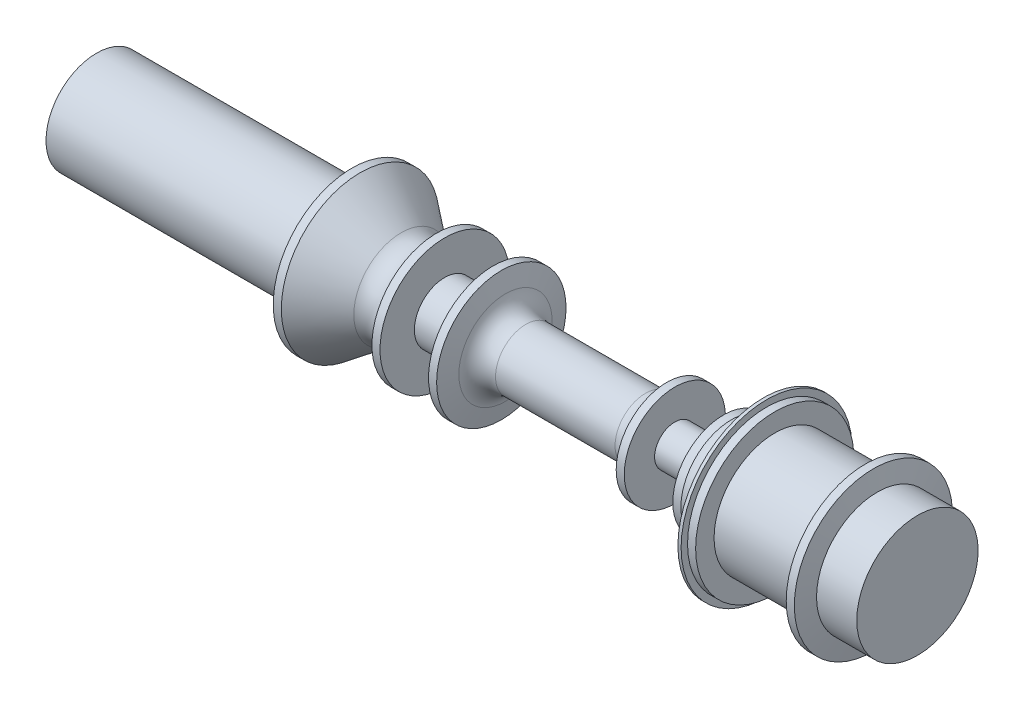
ISO-10303-21;
HEADER;
FILE_DESCRIPTION(('STEP AP214'),'2;1');
FILE_NAME('part.step','',(''),(''),'','','');
FILE_SCHEMA(('AUTOMOTIVE_DESIGN { 1 0 10303 214 1 1 1 1 }'));
ENDSEC;
DATA;
#1=APPLICATION_CONTEXT('core data for automotive mechanical design processes');
#2=APPLICATION_PROTOCOL_DEFINITION('international standard','automotive_design',2000,#1);
#3=PRODUCT_CONTEXT('',#1,'mechanical');
#4=PRODUCT('Part','Part','',(#3));
#5=PRODUCT_RELATED_PRODUCT_CATEGORY('part','',(#4));
#6=PRODUCT_DEFINITION_FORMATION('','',#4);
#7=PRODUCT_DEFINITION_CONTEXT('part definition',#1,'design');
#8=PRODUCT_DEFINITION('design','',#6,#7);
#9=PRODUCT_DEFINITION_SHAPE('','',#8);
#10=(LENGTH_UNIT() NAMED_UNIT(*) SI_UNIT(.MILLI.,.METRE.));
#11=(NAMED_UNIT(*) PLANE_ANGLE_UNIT() SI_UNIT($,.RADIAN.));
#12=(NAMED_UNIT(*) SI_UNIT($,.STERADIAN.) SOLID_ANGLE_UNIT());
#13=UNCERTAINTY_MEASURE_WITH_UNIT(LENGTH_MEASURE(1.E-05),#10,'distance_accuracy_value','');
#14=(GEOMETRIC_REPRESENTATION_CONTEXT(3) GLOBAL_UNCERTAINTY_ASSIGNED_CONTEXT((#13)) GLOBAL_UNIT_ASSIGNED_CONTEXT((#10,
#11,#12)) REPRESENTATION_CONTEXT('',''));
#15=CARTESIAN_POINT('',(0.,0.,0.));
#16=DIRECTION('',(0.,0.,1.));
#17=DIRECTION('',(1.,0.,0.));
#18=AXIS2_PLACEMENT_3D('',#15,#16,#17);
#19=CARTESIAN_POINT('',(296.06984855274,0.,0.));
#20=DIRECTION('',(1.,0.,0.));
#21=DIRECTION('',(0.,0.,-1.));
#22=AXIS2_PLACEMENT_3D('',#19,#20,#21);
#23=CYLINDRICAL_SURFACE('',#22,21.745125);
#24=CARTESIAN_POINT('',(50.8462213941202,0.,0.));
#25=DIRECTION('',(-1.,0.,0.));
#26=DIRECTION('',(0.,0.,1.));
#27=AXIS2_PLACEMENT_3D('',#24,#25,#26);
#28=CIRCLE('',#27,21.745125);
#29=CARTESIAN_POINT('',(50.8462213941202,0.,21.745125));
#30=VERTEX_POINT('',#29);
#31=EDGE_CURVE('E55',#30,#30,#28,.T.);
#32=ORIENTED_EDGE('',*,*,#31,.T.);
#33=EDGE_LOOP('',(#32));
#34=FACE_BOUND('',#33,.T.);
#35=CARTESIAN_POINT('',(-34.8404189496195,0.,0.));
#36=DIRECTION('',(1.,0.,0.));
#37=DIRECTION('',(0.,0.,-1.));
#38=AXIS2_PLACEMENT_3D('',#35,#36,#37);
#39=CIRCLE('',#38,21.745125);
#40=CARTESIAN_POINT('',(-34.8404189496195,0.,-21.745125));
#41=VERTEX_POINT('',#40);
#42=EDGE_CURVE('E58',#41,#41,#39,.T.);
#43=ORIENTED_EDGE('',*,*,#42,.T.);
#44=EDGE_LOOP('',(#43));
#45=FACE_BOUND('',#44,.T.);
#46=ADVANCED_FACE('F32',(#34,#45),#23,.T.);
#47=CARTESIAN_POINT('',(-46.7984241363148,0.,0.));
#48=DIRECTION('',(-1.,0.,0.));
#49=DIRECTION('',(0.,0.,1.));
#50=AXIS2_PLACEMENT_3D('',#47,#48,#49);
#51=CONICAL_SURFACE('',#50,21.745125,1.34606300619827);
#52=CARTESIAN_POINT('',(-49.4632225037763,0.,0.));
#53=DIRECTION('',(-1.,0.,0.));
#54=DIRECTION('',(0.,0.,1.));
#55=AXIS2_PLACEMENT_3D('',#52,#53,#54);
#56=CIRCLE('',#55,33.4024290496423);
#57=CARTESIAN_POINT('',(-49.4632225037763,0.,33.4024290496424));
#58=VERTEX_POINT('',#57);
#59=EDGE_CURVE('E47',#58,#58,#56,.T.);
#60=ORIENTED_EDGE('',*,*,#59,.T.);
#61=EDGE_LOOP('',(#60));
#62=FACE_BOUND('',#61,.T.);
#63=CARTESIAN_POINT('',(-52.4320214472609,0.,0.));
#64=DIRECTION('',(1.,0.,0.));
#65=DIRECTION('',(0.,0.,-1.));
#66=AXIS2_PLACEMENT_3D('',#63,#64,#65);
#67=CIRCLE('',#66,46.3896);
#68=CARTESIAN_POINT('',(-52.4320214472609,0.,-46.3896));
#69=VERTEX_POINT('',#68);
#70=EDGE_CURVE('E97',#69,#69,#67,.T.);
#71=ORIENTED_EDGE('',*,*,#70,.T.);
#72=EDGE_LOOP('',(#71));
#73=FACE_BOUND('',#72,.T.);
#74=ADVANCED_FACE('F166',(#62,#73),#51,.T.);
#75=CARTESIAN_POINT('',(296.06984855274,0.,0.));
#76=DIRECTION('',(1.,0.,0.));
#77=DIRECTION('',(0.,0.,-1.));
#78=AXIS2_PLACEMENT_3D('',#75,#76,#77);
#79=CYLINDRICAL_SURFACE('',#78,46.3896);
#80=CARTESIAN_POINT('',(-58.2307214472609,0.,0.));
#81=DIRECTION('',(1.,0.,0.));
#82=DIRECTION('',(0.,0.,-1.));
#83=AXIS2_PLACEMENT_3D('',#80,#81,#82);
#84=CIRCLE('',#83,46.3896);
#85=CARTESIAN_POINT('',(-58.2307214472609,0.,-46.3896));
#86=VERTEX_POINT('',#85);
#87=EDGE_CURVE('E94',#86,#86,#84,.T.);
#88=ORIENTED_EDGE('',*,*,#87,.T.);
#89=EDGE_LOOP('',(#88));
#90=FACE_BOUND('',#89,.T.);
#91=ORIENTED_EDGE('',*,*,#70,.F.);
#92=EDGE_LOOP('',(#91));
#93=FACE_BOUND('',#92,.T.);
#94=ADVANCED_FACE('F172',(#90,#93),#79,.T.);
#95=CARTESIAN_POINT('',(-58.2307214472609,0.,-46.3896));
#96=DIRECTION('',(-1.,0.,0.));
#97=DIRECTION('',(0.,0.,1.));
#98=AXIS2_PLACEMENT_3D('',#95,#96,#97);
#99=PLANE('',#98);
#100=CARTESIAN_POINT('',(-58.2307214472609,0.,0.));
#101=DIRECTION('',(1.,0.,0.));
#102=DIRECTION('',(0.,0.,-1.));
#103=AXIS2_PLACEMENT_3D('',#100,#101,#102);
#104=CIRCLE('',#103,21.745125);
#105=CARTESIAN_POINT('',(-58.2307214472609,0.,-21.745125));
#106=VERTEX_POINT('',#105);
#107=EDGE_CURVE('E91',#106,#106,#104,.T.);
#108=ORIENTED_EDGE('',*,*,#107,.T.);
#109=EDGE_LOOP('',(#108));
#110=FACE_BOUND('',#109,.T.);
#111=ORIENTED_EDGE('',*,*,#87,.F.);
#112=EDGE_LOOP('',(#111));
#113=FACE_BOUND('',#112,.T.);
#114=ADVANCED_FACE('F182',(#110,#113),#99,.T.);
#115=CARTESIAN_POINT('',(296.06984855274,0.,0.));
#116=DIRECTION('',(1.,0.,0.));
#117=DIRECTION('',(0.,0.,-1.));
#118=AXIS2_PLACEMENT_3D('',#115,#116,#117);
#119=CYLINDRICAL_SURFACE('',#118,21.745125);
#120=CARTESIAN_POINT('',(-93.0229214472609,0.,0.));
#121=DIRECTION('',(1.,0.,0.));
#122=DIRECTION('',(0.,0.,-1.));
#123=AXIS2_PLACEMENT_3D('',#120,#121,#122);
#124=CIRCLE('',#123,21.745125);
#125=CARTESIAN_POINT('',(-93.0229214472609,0.,-21.745125));
#126=VERTEX_POINT('',#125);
#127=EDGE_CURVE('E88',#126,#126,#124,.T.);
#128=ORIENTED_EDGE('',*,*,#127,.T.);
#129=EDGE_LOOP('',(#128));
#130=FACE_BOUND('',#129,.T.);
#131=ORIENTED_EDGE('',*,*,#107,.F.);
#132=EDGE_LOOP('',(#131));
#133=FACE_BOUND('',#132,.T.);
#134=ADVANCED_FACE('F186',(#130,#133),#119,.T.);
#135=CARTESIAN_POINT('',(-93.0229214472609,0.,-46.3896));
#136=DIRECTION('',(1.,0.,0.));
#137=DIRECTION('',(0.,0.,-1.));
#138=AXIS2_PLACEMENT_3D('',#135,#136,#137);
#139=PLANE('',#138);
#140=CARTESIAN_POINT('',(-93.0229214472609,0.,0.));
#141=DIRECTION('',(1.,0.,0.));
#142=DIRECTION('',(0.,0.,-1.));
#143=AXIS2_PLACEMENT_3D('',#140,#141,#142);
#144=CIRCLE('',#143,46.3896);
#145=CARTESIAN_POINT('',(-93.0229214472609,0.,-46.3896));
#146=VERTEX_POINT('',#145);
#147=EDGE_CURVE('E85',#146,#146,#144,.T.);
#148=ORIENTED_EDGE('',*,*,#147,.T.);
#149=EDGE_LOOP('',(#148));
#150=FACE_BOUND('',#149,.T.);
#151=ORIENTED_EDGE('',*,*,#127,.F.);
#152=EDGE_LOOP('',(#151));
#153=FACE_BOUND('',#152,.T.);
#154=ADVANCED_FACE('F190',(#150,#153),#139,.T.);
#155=CARTESIAN_POINT('',(296.06984855274,0.,0.));
#156=DIRECTION('',(1.,0.,0.));
#157=DIRECTION('',(0.,0.,-1.));
#158=AXIS2_PLACEMENT_3D('',#155,#156,#157);
#159=CYLINDRICAL_SURFACE('',#158,46.3896);
#160=CARTESIAN_POINT('',(-98.8216214472609,0.,0.));
#161=DIRECTION('',(1.,0.,0.));
#162=DIRECTION('',(0.,0.,-1.));
#163=AXIS2_PLACEMENT_3D('',#160,#161,#162);
#164=CIRCLE('',#163,46.3896);
#165=CARTESIAN_POINT('',(-98.8216214472609,0.,-46.3896));
#166=VERTEX_POINT('',#165);
#167=EDGE_CURVE('E82',#166,#166,#164,.T.);
#168=ORIENTED_EDGE('',*,*,#167,.T.);
#169=EDGE_LOOP('',(#168));
#170=FACE_BOUND('',#169,.T.);
#171=ORIENTED_EDGE('',*,*,#147,.F.);
#172=EDGE_LOOP('',(#171));
#173=FACE_BOUND('',#172,.T.);
#174=ADVANCED_FACE('F194',(#170,#173),#159,.T.);
#175=CARTESIAN_POINT('',(-98.8216214472609,0.,0.));
#176=DIRECTION('',(1.,0.,0.));
#177=DIRECTION('',(0.,0.,-1.));
#178=AXIS2_PLACEMENT_3D('',#175,#176,#177);
#179=CONICAL_SURFACE('',#178,46.3896,1.20730668683403);
#180=CARTESIAN_POINT('',(-101.038175072092,0.,0.));
#181=DIRECTION('',(1.,0.,0.));
#182=DIRECTION('',(0.,0.,-1.));
#183=AXIS2_PLACEMENT_3D('',#180,#181,#182);
#184=CIRCLE('',#183,40.5625775842079);
#185=CARTESIAN_POINT('',(-101.038175072092,0.,-40.5625775842078));
#186=VERTEX_POINT('',#185);
#187=EDGE_CURVE('E64',#186,#186,#184,.T.);
#188=ORIENTED_EDGE('',*,*,#187,.T.);
#189=EDGE_LOOP('',(#188));
#190=FACE_BOUND('',#189,.T.);
#191=ORIENTED_EDGE('',*,*,#167,.F.);
#192=EDGE_LOOP('',(#191));
#193=FACE_BOUND('',#192,.T.);
#194=ADVANCED_FACE('F198',(#190,#193),#179,.T.);
#195=CARTESIAN_POINT('',(-108.196186447261,0.,0.));
#196=DIRECTION('',(-1.,0.,0.));
#197=DIRECTION('',(0.,0.,1.));
#198=AXIS2_PLACEMENT_3D('',#195,#196,#197);
#199=CONICAL_SURFACE('',#198,21.745125,0.65363589691952);
#200=CARTESIAN_POINT('',(-124.179255500738,0.,0.));
#201=DIRECTION('',(-1.,0.,0.));
#202=DIRECTION('',(0.,0.,1.));
#203=AXIS2_PLACEMENT_3D('',#200,#201,#202);
#204=CIRCLE('',#203,33.9874757643652);
#205=CARTESIAN_POINT('',(-124.179255500738,0.,33.9874757643653));
#206=VERTEX_POINT('',#205);
#207=EDGE_CURVE('E61',#206,#206,#204,.T.);
#208=ORIENTED_EDGE('',*,*,#207,.T.);
#209=EDGE_LOOP('',(#208));
#210=FACE_BOUND('',#209,.T.);
#211=CARTESIAN_POINT('',(-153.619336447261,0.,0.));
#212=DIRECTION('',(1.,0.,0.));
#213=DIRECTION('',(0.,0.,-1.));
#214=AXIS2_PLACEMENT_3D('',#211,#212,#213);
#215=CIRCLE('',#214,56.537325);
#216=CARTESIAN_POINT('',(-153.619336447261,0.,-56.537325));
#217=VERTEX_POINT('',#216);
#218=EDGE_CURVE('E79',#217,#217,#215,.T.);
#219=ORIENTED_EDGE('',*,*,#218,.T.);
#220=EDGE_LOOP('',(#219));
#221=FACE_BOUND('',#220,.T.);
#222=ADVANCED_FACE('F202',(#210,#221),#199,.T.);
#223=CARTESIAN_POINT('',(296.06984855274,0.,0.));
#224=DIRECTION('',(1.,0.,0.));
#225=DIRECTION('',(0.,0.,-1.));
#226=AXIS2_PLACEMENT_3D('',#223,#224,#225);
#227=CYLINDRICAL_SURFACE('',#226,56.537325);
#228=CARTESIAN_POINT('',(-159.418036447261,0.,0.));
#229=DIRECTION('',(1.,0.,0.));
#230=DIRECTION('',(0.,0.,-1.));
#231=AXIS2_PLACEMENT_3D('',#228,#229,#230);
#232=CIRCLE('',#231,56.537325);
#233=CARTESIAN_POINT('',(-159.418036447261,0.,-56.537325));
#234=VERTEX_POINT('',#233);
#235=EDGE_CURVE('E76',#234,#234,#232,.T.);
#236=ORIENTED_EDGE('',*,*,#235,.T.);
#237=EDGE_LOOP('',(#236));
#238=FACE_BOUND('',#237,.T.);
#239=ORIENTED_EDGE('',*,*,#218,.F.);
#240=EDGE_LOOP('',(#239));
#241=FACE_BOUND('',#240,.T.);
#242=ADVANCED_FACE('F161',(#238,#241),#227,.T.);
#243=CARTESIAN_POINT('',(-159.418036447261,0.,-36.241875));
#244=DIRECTION('',(-1.,0.,0.));
#245=DIRECTION('',(0.,0.,1.));
#246=AXIS2_PLACEMENT_3D('',#243,#244,#245);
#247=PLANE('',#246);
#248=CARTESIAN_POINT('',(-159.418036447261,0.,0.));
#249=DIRECTION('',(1.,0.,0.));
#250=DIRECTION('',(0.,0.,-1.));
#251=AXIS2_PLACEMENT_3D('',#248,#249,#250);
#252=CIRCLE('',#251,36.241875);
#253=CARTESIAN_POINT('',(-159.418036447261,0.,-36.241875));
#254=VERTEX_POINT('',#253);
#255=EDGE_CURVE('E73',#254,#254,#252,.T.);
#256=ORIENTED_EDGE('',*,*,#255,.T.);
#257=EDGE_LOOP('',(#256));
#258=FACE_BOUND('',#257,.T.);
#259=ORIENTED_EDGE('',*,*,#235,.F.);
#260=EDGE_LOOP('',(#259));
#261=FACE_BOUND('',#260,.T.);
#262=ADVANCED_FACE('F151',(#258,#261),#247,.T.);
#263=CARTESIAN_POINT('',(296.06984855274,0.,0.));
#264=DIRECTION('',(1.,0.,0.));
#265=DIRECTION('',(0.,0.,-1.));
#266=AXIS2_PLACEMENT_3D('',#263,#264,#265);
#267=CYLINDRICAL_SURFACE('',#266,36.241875);
#268=ORIENTED_EDGE('',*,*,#255,.F.);
#269=EDGE_LOOP('',(#268));
#270=FACE_BOUND('',#269,.T.);
#271=CARTESIAN_POINT('',(-342.602101447261,0.,0.));
#272=DIRECTION('',(-1.,0.,0.));
#273=DIRECTION('',(0.,0.,1.));
#274=AXIS2_PLACEMENT_3D('',#271,#272,#273);
#275=CIRCLE('',#274,36.2418750000001);
#276=CARTESIAN_POINT('',(-342.602101447261,0.,36.2418750000001));
#277=VERTEX_POINT('',#276);
#278=EDGE_CURVE('E142',#277,#277,#275,.T.);
#279=ORIENTED_EDGE('',*,*,#278,.F.);
#280=EDGE_LOOP('',(#279));
#281=FACE_BOUND('',#280,.T.);
#282=ADVANCED_FACE('F148',(#270,#281),#267,.T.);
#283=CARTESIAN_POINT('',(71.9500935527391,0.,0.));
#284=DIRECTION('',(-1.,0.,0.));
#285=DIRECTION('',(0.,0.,1.));
#286=AXIS2_PLACEMENT_3D('',#283,#284,#285);
#287=PLANE('',#286);
#288=CARTESIAN_POINT('',(71.9500935527391,0.,0.));
#289=DIRECTION('',(-1.,0.,0.));
#290=DIRECTION('',(0.,0.,1.));
#291=AXIS2_PLACEMENT_3D('',#288,#289,#290);
#292=CIRCLE('',#291,14.49675);
#293=CARTESIAN_POINT('',(71.9500935527391,0.,14.49675));
#294=VERTEX_POINT('',#293);
#295=EDGE_CURVE('E103',#294,#294,#292,.T.);
#296=ORIENTED_EDGE('',*,*,#295,.T.);
#297=EDGE_LOOP('',(#296));
#298=FACE_BOUND('',#297,.T.);
#299=CARTESIAN_POINT('',(71.9500935527391,0.,0.));
#300=DIRECTION('',(-1.,0.,0.));
#301=DIRECTION('',(0.,0.,1.));
#302=AXIS2_PLACEMENT_3D('',#299,#300,#301);
#303=CIRCLE('',#302,36.2418750000001);
#304=CARTESIAN_POINT('',(71.9500935527391,0.,36.241875));
#305=VERTEX_POINT('',#304);
#306=EDGE_CURVE('E70',#305,#305,#303,.T.);
#307=ORIENTED_EDGE('',*,*,#306,.F.);
#308=EDGE_LOOP('',(#307));
#309=FACE_BOUND('',#308,.T.);
#310=ADVANCED_FACE('F150',(#298,#309),#287,.F.);
#311=CARTESIAN_POINT('',(57.4533435527391,0.,0.));
#312=DIRECTION('',(-1.,0.,0.));
#313=DIRECTION('',(0.,0.,1.));
#314=AXIS2_PLACEMENT_3D('',#311,#312,#313);
#315=CYLINDRICAL_SURFACE('',#314,36.241875);
#316=CARTESIAN_POINT('',(66.1513935527391,0.,0.));
#317=DIRECTION('',(-1.,0.,0.));
#318=DIRECTION('',(0.,0.,1.));
#319=AXIS2_PLACEMENT_3D('',#316,#317,#318);
#320=CIRCLE('',#319,36.241875);
#321=CARTESIAN_POINT('',(66.1513935527391,0.,36.241875));
#322=VERTEX_POINT('',#321);
#323=EDGE_CURVE('E67',#322,#322,#320,.T.);
#324=ORIENTED_EDGE('',*,*,#323,.F.);
#325=EDGE_LOOP('',(#324));
#326=FACE_BOUND('',#325,.T.);
#327=ORIENTED_EDGE('',*,*,#306,.T.);
#328=EDGE_LOOP('',(#327));
#329=FACE_BOUND('',#328,.T.);
#330=ADVANCED_FACE('F158',(#326,#329),#315,.T.);
#331=CARTESIAN_POINT('',(66.1513935527391,0.,0.));
#332=DIRECTION('',(1.,0.,0.));
#333=DIRECTION('',(0.,0.,-1.));
#334=AXIS2_PLACEMENT_3D('',#331,#332,#333);
#335=CONICAL_SURFACE('',#334,36.241875,1.33525134607403);
#336=CARTESIAN_POINT('',(65.4320309238279,0.,0.));
#337=DIRECTION('',(-1.,0.,0.));
#338=DIRECTION('',(0.,0.,1.));
#339=AXIS2_PLACEMENT_3D('',#336,#337,#338);
#340=CIRCLE('',#339,33.2445307128702);
#341=CARTESIAN_POINT('',(65.4320309238279,0.,33.2445307128701));
#342=VERTEX_POINT('',#341);
#343=EDGE_CURVE('E52',#342,#342,#340,.F.);
#344=ORIENTED_EDGE('',*,*,#343,.T.);
#345=EDGE_LOOP('',(#344));
#346=FACE_BOUND('',#345,.T.);
#347=ORIENTED_EDGE('',*,*,#323,.T.);
#348=EDGE_LOOP('',(#347));
#349=FACE_BOUND('',#348,.T.);
#350=ADVANCED_FACE('F241',(#346,#349),#335,.T.);
#351=CARTESIAN_POINT('',(106.742293552739,36.241875,0.));
#352=DIRECTION('',(1.,0.,0.));
#353=DIRECTION('',(0.,0.,-1.));
#354=AXIS2_PLACEMENT_3D('',#351,#352,#353);
#355=PLANE('',#354);
#356=CARTESIAN_POINT('',(106.742293552739,0.,0.));
#357=DIRECTION('',(-1.,0.,0.));
#358=DIRECTION('',(0.,0.,1.));
#359=AXIS2_PLACEMENT_3D('',#356,#357,#358);
#360=CIRCLE('',#359,14.49675);
#361=CARTESIAN_POINT('',(106.742293552739,0.,14.49675));
#362=VERTEX_POINT('',#361);
#363=EDGE_CURVE('E100',#362,#362,#360,.T.);
#364=ORIENTED_EDGE('',*,*,#363,.F.);
#365=EDGE_LOOP('',(#364));
#366=FACE_BOUND('',#365,.T.);
#367=CARTESIAN_POINT('',(106.742293552739,0.,0.));
#368=DIRECTION('',(-1.,0.,0.));
#369=DIRECTION('',(0.,0.,1.));
#370=AXIS2_PLACEMENT_3D('',#367,#368,#369);
#371=CIRCLE('',#370,36.241875);
#372=CARTESIAN_POINT('',(106.742293552739,0.,36.241875));
#373=VERTEX_POINT('',#372);
#374=EDGE_CURVE('E133',#373,#373,#371,.T.);
#375=ORIENTED_EDGE('',*,*,#374,.T.);
#376=EDGE_LOOP('',(#375));
#377=FACE_BOUND('',#376,.T.);
#378=ADVANCED_FACE('F177',(#366,#377),#355,.F.);
#379=CARTESIAN_POINT('',(71.9500935527391,0.,0.));
#380=DIRECTION('',(-1.,0.,0.));
#381=DIRECTION('',(0.,0.,1.));
#382=AXIS2_PLACEMENT_3D('',#379,#380,#381);
#383=CYLINDRICAL_SURFACE('',#382,14.49675);
#384=ORIENTED_EDGE('',*,*,#295,.F.);
#385=EDGE_LOOP('',(#384));
#386=FACE_BOUND('',#385,.T.);
#387=ORIENTED_EDGE('',*,*,#363,.T.);
#388=EDGE_LOOP('',(#387));
#389=FACE_BOUND('',#388,.T.);
#390=ADVANCED_FACE('F259',(#386,#389),#383,.T.);
#391=CARTESIAN_POINT('',(71.9500935527391,0.,0.));
#392=DIRECTION('',(-1.,0.,0.));
#393=DIRECTION('',(0.,0.,1.));
#394=AXIS2_PLACEMENT_3D('',#391,#392,#393);
#395=CYLINDRICAL_SURFACE('',#394,36.241875);
#396=ORIENTED_EDGE('',*,*,#374,.F.);
#397=EDGE_LOOP('',(#396));
#398=FACE_BOUND('',#397,.T.);
#399=CARTESIAN_POINT('',(112.540993552739,0.,0.));
#400=DIRECTION('',(-1.,0.,0.));
#401=DIRECTION('',(0.,0.,1.));
#402=AXIS2_PLACEMENT_3D('',#399,#400,#401);
#403=CIRCLE('',#402,36.241875);
#404=CARTESIAN_POINT('',(112.540993552739,0.,36.241875));
#405=VERTEX_POINT('',#404);
#406=EDGE_CURVE('E130',#405,#405,#403,.T.);
#407=ORIENTED_EDGE('',*,*,#406,.T.);
#408=EDGE_LOOP('',(#407));
#409=FACE_BOUND('',#408,.T.);
#410=ADVANCED_FACE('F268',(#398,#409),#395,.T.);
#411=CARTESIAN_POINT('',(-115.05810233391,0.,0.));
#412=DIRECTION('',(1.,0.,0.));
#413=DIRECTION('',(0.,0.,-1.));
#414=AXIS2_PLACEMENT_3D('',#411,#412,#413);
#415=TOROIDAL_SURFACE('',#414,45.8956479543898,15.);
#416=ORIENTED_EDGE('',*,*,#207,.F.);
#417=EDGE_LOOP('',(#416));
#418=FACE_BOUND('',#417,.T.);
#419=ORIENTED_EDGE('',*,*,#187,.F.);
#420=EDGE_LOOP('',(#419));
#421=FACE_BOUND('',#420,.T.);
#422=ADVANCED_FACE('F278',(#418,#421),#415,.F.);
#423=CARTESIAN_POINT('',(117.883327615519,0.,0.));
#424=DIRECTION('',(-1.,0.,0.));
#425=DIRECTION('',(0.,0.,1.));
#426=AXIS2_PLACEMENT_3D('',#423,#424,#425);
#427=TOROIDAL_SURFACE('',#426,50.2582749215798,15.);
#428=CARTESIAN_POINT('',(131.094808933832,0.,0.));
#429=DIRECTION('',(-1.,0.,0.));
#430=DIRECTION('',(0.,0.,1.));
#431=AXIS2_PLACEMENT_3D('',#428,#429,#430);
#432=CIRCLE('',#431,43.1549826302647);
#433=CARTESIAN_POINT('',(131.094808933832,0.,43.1549826302647));
#434=VERTEX_POINT('',#433);
#435=EDGE_CURVE('E10',#434,#434,#432,.T.);
#436=ORIENTED_EDGE('',*,*,#435,.T.);
#437=EDGE_LOOP('',(#436));
#438=FACE_BOUND('',#437,.T.);
#439=ORIENTED_EDGE('',*,*,#406,.F.);
#440=EDGE_LOOP('',(#439));
#441=FACE_BOUND('',#440,.T.);
#442=ADVANCED_FACE('F290',(#438,#441),#427,.F.);
#443=CARTESIAN_POINT('',(50.8462213941202,0.,0.));
#444=DIRECTION('',(-1.,0.,0.));
#445=DIRECTION('',(0.,0.,1.));
#446=AXIS2_PLACEMENT_3D('',#443,#444,#445);
#447=TOROIDAL_SURFACE('',#446,36.745125,15.);
#448=ORIENTED_EDGE('',*,*,#343,.F.);
#449=EDGE_LOOP('',(#448));
#450=FACE_BOUND('',#449,.T.);
#451=ORIENTED_EDGE('',*,*,#31,.F.);
#452=EDGE_LOOP('',(#451));
#453=FACE_BOUND('',#452,.T.);
#454=ADVANCED_FACE('F300',(#450,#453),#447,.F.);
#455=CARTESIAN_POINT('',(-34.8404189496195,0.,0.));
#456=DIRECTION('',(1.,0.,0.));
#457=DIRECTION('',(0.,0.,-1.));
#458=AXIS2_PLACEMENT_3D('',#455,#456,#457);
#459=TOROIDAL_SURFACE('',#458,36.745125,15.);
#460=ORIENTED_EDGE('',*,*,#59,.F.);
#461=EDGE_LOOP('',(#460));
#462=FACE_BOUND('',#461,.T.);
#463=ORIENTED_EDGE('',*,*,#42,.F.);
#464=EDGE_LOOP('',(#463));
#465=FACE_BOUND('',#464,.T.);
#466=ADVANCED_FACE('F309',(#462,#465),#459,.F.);
#467=CARTESIAN_POINT('',(135.477193512955,0.,0.));
#468=DIRECTION('',(1.,0.,0.));
#469=DIRECTION('',(0.,0.,-1.));
#470=AXIS2_PLACEMENT_3D('',#467,#468,#469);
#471=CONICAL_SURFACE('',#470,61.3255610197802,1.3525543663775);
#472=CARTESIAN_POINT('',(132.080814180279,0.,0.));
#473=DIRECTION('',(-1.,0.,0.));
#474=DIRECTION('',(0.,0.,1.));
#475=AXIS2_PLACEMENT_3D('',#472,#473,#474);
#476=CIRCLE('',#475,46.0109778469833);
#477=CARTESIAN_POINT('',(132.080814180279,0.,46.0109778469833));
#478=VERTEX_POINT('',#477);
#479=EDGE_CURVE('E43',#478,#478,#476,.F.);
#480=ORIENTED_EDGE('',*,*,#479,.T.);
#481=EDGE_LOOP('',(#480));
#482=FACE_BOUND('',#481,.T.);
#483=CARTESIAN_POINT('',(135.477193512955,0.,0.));
#484=DIRECTION('',(-1.,0.,0.));
#485=DIRECTION('',(0.,0.,1.));
#486=AXIS2_PLACEMENT_3D('',#483,#484,#485);
#487=CIRCLE('',#486,61.3255610197802);
#488=CARTESIAN_POINT('',(135.477193512955,0.,61.3255610197802));
#489=VERTEX_POINT('',#488);
#490=EDGE_CURVE('E139',#489,#489,#487,.T.);
#491=ORIENTED_EDGE('',*,*,#490,.T.);
#492=EDGE_LOOP('',(#491));
#493=FACE_BOUND('',#492,.T.);
#494=ADVANCED_FACE('F319',(#482,#493),#471,.T.);
#495=CARTESIAN_POINT('',(137.765338552739,0.,0.));
#496=DIRECTION('',(-1.,0.,0.));
#497=DIRECTION('',(0.,0.,1.));
#498=AXIS2_PLACEMENT_3D('',#495,#496,#497);
#499=PLANE('',#498);
#500=CARTESIAN_POINT('',(137.765338552739,0.,0.));
#501=DIRECTION('',(-1.,0.,0.));
#502=DIRECTION('',(0.,0.,1.));
#503=AXIS2_PLACEMENT_3D('',#500,#501,#502);
#504=CIRCLE('',#503,56.7059897531441);
#505=CARTESIAN_POINT('',(137.765338552739,0.,56.7059897531441));
#506=VERTEX_POINT('',#505);
#507=EDGE_CURVE('E127',#506,#506,#504,.T.);
#508=ORIENTED_EDGE('',*,*,#507,.T.);
#509=EDGE_LOOP('',(#508));
#510=FACE_BOUND('',#509,.T.);
#511=CARTESIAN_POINT('',(137.765338552739,0.,0.));
#512=DIRECTION('',(-1.,0.,0.));
#513=DIRECTION('',(0.,0.,1.));
#514=AXIS2_PLACEMENT_3D('',#511,#512,#513);
#515=CIRCLE('',#514,61.3255610197802);
#516=CARTESIAN_POINT('',(137.765338552739,0.,61.3255610197802));
#517=VERTEX_POINT('',#516);
#518=EDGE_CURVE('E136',#517,#517,#515,.T.);
#519=ORIENTED_EDGE('',*,*,#518,.F.);
#520=EDGE_LOOP('',(#519));
#521=FACE_BOUND('',#520,.T.);
#522=ADVANCED_FACE('F329',(#510,#521),#499,.F.);
#523=CARTESIAN_POINT('',(124.996292215776,0.,0.));
#524=DIRECTION('',(-1.,0.,0.));
#525=DIRECTION('',(0.,0.,1.));
#526=AXIS2_PLACEMENT_3D('',#523,#524,#525);
#527=CYLINDRICAL_SURFACE('',#526,61.3255610197802);
#528=ORIENTED_EDGE('',*,*,#490,.F.);
#529=EDGE_LOOP('',(#528));
#530=FACE_BOUND('',#529,.T.);
#531=ORIENTED_EDGE('',*,*,#518,.T.);
#532=EDGE_LOOP('',(#531));
#533=FACE_BOUND('',#532,.T.);
#534=ADVANCED_FACE('F339',(#530,#533),#527,.T.);
#535=CARTESIAN_POINT('',(245.881506483684,43.49025,0.));
#536=DIRECTION('',(-1.,0.,0.));
#537=DIRECTION('',(0.,0.,1.));
#538=AXIS2_PLACEMENT_3D('',#535,#536,#537);
#539=PLANE('',#538);
#540=CARTESIAN_POINT('',(245.881506483684,0.,0.));
#541=DIRECTION('',(-1.,0.,0.));
#542=DIRECTION('',(0.,0.,1.));
#543=AXIS2_PLACEMENT_3D('',#540,#541,#542);
#544=CIRCLE('',#543,43.49025);
#545=CARTESIAN_POINT('',(245.881506483684,0.,43.49025));
#546=VERTEX_POINT('',#545);
#547=EDGE_CURVE('E106',#546,#546,#544,.T.);
#548=ORIENTED_EDGE('',*,*,#547,.F.);
#549=EDGE_LOOP('',(#548));
#550=FACE_BOUND('',#549,.T.);
#551=ADVANCED_FACE('F349',(#550),#539,.F.);
#552=CARTESIAN_POINT('',(71.9500935527391,0.,0.));
#553=DIRECTION('',(-1.,0.,0.));
#554=DIRECTION('',(0.,0.,1.));
#555=AXIS2_PLACEMENT_3D('',#552,#553,#554);
#556=CYLINDRICAL_SURFACE('',#555,43.49025);
#557=CARTESIAN_POINT('',(217.031824664218,0.,0.));
#558=DIRECTION('',(-1.,0.,0.));
#559=DIRECTION('',(0.,0.,1.));
#560=AXIS2_PLACEMENT_3D('',#557,#558,#559);
#561=CIRCLE('',#560,43.49025);
#562=CARTESIAN_POINT('',(217.031824664218,0.,43.49025));
#563=VERTEX_POINT('',#562);
#564=EDGE_CURVE('E109',#563,#563,#561,.T.);
#565=ORIENTED_EDGE('',*,*,#564,.F.);
#566=EDGE_LOOP('',(#565));
#567=FACE_BOUND('',#566,.T.);
#568=ORIENTED_EDGE('',*,*,#547,.T.);
#569=EDGE_LOOP('',(#568));
#570=FACE_BOUND('',#569,.T.);
#571=ADVANCED_FACE('F359',(#567,#570),#556,.T.);
#572=CARTESIAN_POINT('',(217.031824664218,0.,0.));
#573=DIRECTION('',(-1.,0.,0.));
#574=DIRECTION('',(0.,0.,1.));
#575=AXIS2_PLACEMENT_3D('',#572,#573,#574);
#576=CONICAL_SURFACE('',#575,43.49025,1.36755087601883);
#577=CARTESIAN_POINT('',(214.308178552739,0.,0.));
#578=DIRECTION('',(-1.,0.,0.));
#579=DIRECTION('',(0.,0.,1.));
#580=AXIS2_PLACEMENT_3D('',#577,#578,#579);
#581=CIRCLE('',#580,56.7059897531441);
#582=CARTESIAN_POINT('',(214.308178552739,0.,56.7059897531441));
#583=VERTEX_POINT('',#582);
#584=EDGE_CURVE('E112',#583,#583,#581,.T.);
#585=ORIENTED_EDGE('',*,*,#584,.F.);
#586=EDGE_LOOP('',(#585));
#587=FACE_BOUND('',#586,.T.);
#588=ORIENTED_EDGE('',*,*,#564,.T.);
#589=EDGE_LOOP('',(#588));
#590=FACE_BOUND('',#589,.T.);
#591=ADVANCED_FACE('F369',(#587,#590),#576,.T.);
#592=CARTESIAN_POINT('',(71.9500935527391,0.,0.));
#593=DIRECTION('',(-1.,0.,0.));
#594=DIRECTION('',(0.,0.,1.));
#595=AXIS2_PLACEMENT_3D('',#592,#593,#594);
#596=CYLINDRICAL_SURFACE('',#595,56.7059897531441);
#597=CARTESIAN_POINT('',(208.509478552739,0.,0.));
#598=DIRECTION('',(-1.,0.,0.));
#599=DIRECTION('',(0.,0.,1.));
#600=AXIS2_PLACEMENT_3D('',#597,#598,#599);
#601=CIRCLE('',#600,56.7059897531441);
#602=CARTESIAN_POINT('',(208.509478552739,0.,56.7059897531441));
#603=VERTEX_POINT('',#602);
#604=EDGE_CURVE('E115',#603,#603,#601,.T.);
#605=ORIENTED_EDGE('',*,*,#604,.F.);
#606=EDGE_LOOP('',(#605));
#607=FACE_BOUND('',#606,.T.);
#608=ORIENTED_EDGE('',*,*,#584,.T.);
#609=EDGE_LOOP('',(#608));
#610=FACE_BOUND('',#609,.T.);
#611=ADVANCED_FACE('F379',(#607,#610),#596,.T.);
#612=CARTESIAN_POINT('',(208.509478552739,43.49025,0.));
#613=DIRECTION('',(1.,0.,0.));
#614=DIRECTION('',(0.,0.,-1.));
#615=AXIS2_PLACEMENT_3D('',#612,#613,#614);
#616=PLANE('',#615);
#617=CARTESIAN_POINT('',(208.509478552739,0.,0.));
#618=DIRECTION('',(-1.,0.,0.));
#619=DIRECTION('',(0.,0.,1.));
#620=AXIS2_PLACEMENT_3D('',#617,#618,#619);
#621=CIRCLE('',#620,43.49025);
#622=CARTESIAN_POINT('',(208.509478552739,0.,43.49025));
#623=VERTEX_POINT('',#622);
#624=EDGE_CURVE('E118',#623,#623,#621,.T.);
#625=ORIENTED_EDGE('',*,*,#624,.F.);
#626=EDGE_LOOP('',(#625));
#627=FACE_BOUND('',#626,.T.);
#628=ORIENTED_EDGE('',*,*,#604,.T.);
#629=EDGE_LOOP('',(#628));
#630=FACE_BOUND('',#629,.T.);
#631=ADVANCED_FACE('F389',(#627,#630),#616,.F.);
#632=CARTESIAN_POINT('',(71.9500935527391,0.,0.));
#633=DIRECTION('',(-1.,0.,0.));
#634=DIRECTION('',(0.,0.,1.));
#635=AXIS2_PLACEMENT_3D('',#632,#633,#634);
#636=CYLINDRICAL_SURFACE('',#635,43.49025);
#637=CARTESIAN_POINT('',(143.564038552739,0.,0.));
#638=DIRECTION('',(-1.,0.,0.));
#639=DIRECTION('',(0.,0.,1.));
#640=AXIS2_PLACEMENT_3D('',#637,#638,#639);
#641=CIRCLE('',#640,43.49025);
#642=CARTESIAN_POINT('',(143.564038552739,0.,43.49025));
#643=VERTEX_POINT('',#642);
#644=EDGE_CURVE('E121',#643,#643,#641,.T.);
#645=ORIENTED_EDGE('',*,*,#644,.F.);
#646=EDGE_LOOP('',(#645));
#647=FACE_BOUND('',#646,.T.);
#648=ORIENTED_EDGE('',*,*,#624,.T.);
#649=EDGE_LOOP('',(#648));
#650=FACE_BOUND('',#649,.T.);
#651=ADVANCED_FACE('F399',(#647,#650),#636,.T.);
#652=CARTESIAN_POINT('',(143.564038552739,43.49025,0.));
#653=DIRECTION('',(-1.,0.,0.));
#654=DIRECTION('',(0.,0.,1.));
#655=AXIS2_PLACEMENT_3D('',#652,#653,#654);
#656=PLANE('',#655);
#657=CARTESIAN_POINT('',(143.564038552739,0.,0.));
#658=DIRECTION('',(-1.,0.,0.));
#659=DIRECTION('',(0.,0.,1.));
#660=AXIS2_PLACEMENT_3D('',#657,#658,#659);
#661=CIRCLE('',#660,56.7059897531441);
#662=CARTESIAN_POINT('',(143.564038552739,0.,56.7059897531441));
#663=VERTEX_POINT('',#662);
#664=EDGE_CURVE('E124',#663,#663,#661,.T.);
#665=ORIENTED_EDGE('',*,*,#664,.F.);
#666=EDGE_LOOP('',(#665));
#667=FACE_BOUND('',#666,.T.);
#668=ORIENTED_EDGE('',*,*,#644,.T.);
#669=EDGE_LOOP('',(#668));
#670=FACE_BOUND('',#669,.T.);
#671=ADVANCED_FACE('F409',(#667,#670),#656,.F.);
#672=CARTESIAN_POINT('',(71.9500935527391,0.,0.));
#673=DIRECTION('',(-1.,0.,0.));
#674=DIRECTION('',(0.,0.,1.));
#675=AXIS2_PLACEMENT_3D('',#672,#673,#674);
#676=CYLINDRICAL_SURFACE('',#675,56.7059897531441);
#677=ORIENTED_EDGE('',*,*,#507,.F.);
#678=EDGE_LOOP('',(#677));
#679=FACE_BOUND('',#678,.T.);
#680=ORIENTED_EDGE('',*,*,#664,.T.);
#681=EDGE_LOOP('',(#680));
#682=FACE_BOUND('',#681,.T.);
#683=ADVANCED_FACE('F419',(#679,#682),#676,.T.);
#684=CARTESIAN_POINT('',(117.436620220116,0.,0.));
#685=DIRECTION('',(-1.,0.,0.));
#686=DIRECTION('',(0.,0.,1.));
#687=AXIS2_PLACEMENT_3D('',#684,#685,#686);
#688=TOROIDAL_SURFACE('',#687,49.2586821526645,15.);
#689=CARTESIAN_POINT('',(131.541516329235,0.,0.));
#690=DIRECTION('',(-1.,0.,0.));
#691=DIRECTION('',(0.,0.,1.));
#692=AXIS2_PLACEMENT_3D('',#689,#690,#691);
#693=CIRCLE('',#692,44.1545753991799);
#694=CARTESIAN_POINT('',(131.541516329235,0.,44.1545753991799));
#695=VERTEX_POINT('',#694);
#696=EDGE_CURVE('E39',#695,#695,#693,.F.);
#697=ORIENTED_EDGE('',*,*,#696,.T.);
#698=EDGE_LOOP('',(#697));
#699=FACE_BOUND('',#698,.T.);
#700=ORIENTED_EDGE('',*,*,#479,.F.);
#701=EDGE_LOOP('',(#700));
#702=FACE_BOUND('',#701,.T.);
#703=ADVANCED_FACE('F428',(#699,#702),#688,.F.);
#704=CARTESIAN_POINT('',(124.489068274676,0.,0.));
#705=DIRECTION('',(1.,0.,0.));
#706=DIRECTION('',(0.,0.,-1.));
#707=AXIS2_PLACEMENT_3D('',#704,#705,#706);
#708=TOROIDAL_SURFACE('',#707,46.7066287759223,7.5);
#709=ORIENTED_EDGE('',*,*,#435,.F.);
#710=EDGE_LOOP('',(#709));
#711=FACE_BOUND('',#710,.T.);
#712=ORIENTED_EDGE('',*,*,#696,.F.);
#713=EDGE_LOOP('',(#712));
#714=FACE_BOUND('',#713,.T.);
#715=ADVANCED_FACE('F34',(#711,#714),#708,.F.);
#716=CARTESIAN_POINT('',(-342.602101447261,0.,0.));
#717=DIRECTION('',(-1.,0.,0.));
#718=DIRECTION('',(0.,0.,1.));
#719=AXIS2_PLACEMENT_3D('',#716,#717,#718);
#720=PLANE('',#719);
#721=ORIENTED_EDGE('',*,*,#278,.T.);
#722=EDGE_LOOP('',(#721));
#723=FACE_BOUND('',#722,.T.);
#724=ADVANCED_FACE('F146',(#723),#720,.T.);
#725=CLOSED_SHELL('',(#46,#74,#94,#114,#134,#154,#174,#194,#222,#242,#262,#282,#310,#330,#350,
#378,#390,#410,#422,#442,#454,#466,#494,#522,#534,#551,#571,#591,#611,#631,#651,#671,#683,#703,
#715,#724));
#726=MANIFOLD_SOLID_BREP('B2',#725);
#727=ADVANCED_BREP_SHAPE_REPRESENTATION('',(#18,#726),#14);
#728=SHAPE_DEFINITION_REPRESENTATION(#9,#727);
ENDSEC;
END-ISO-10303-21;
